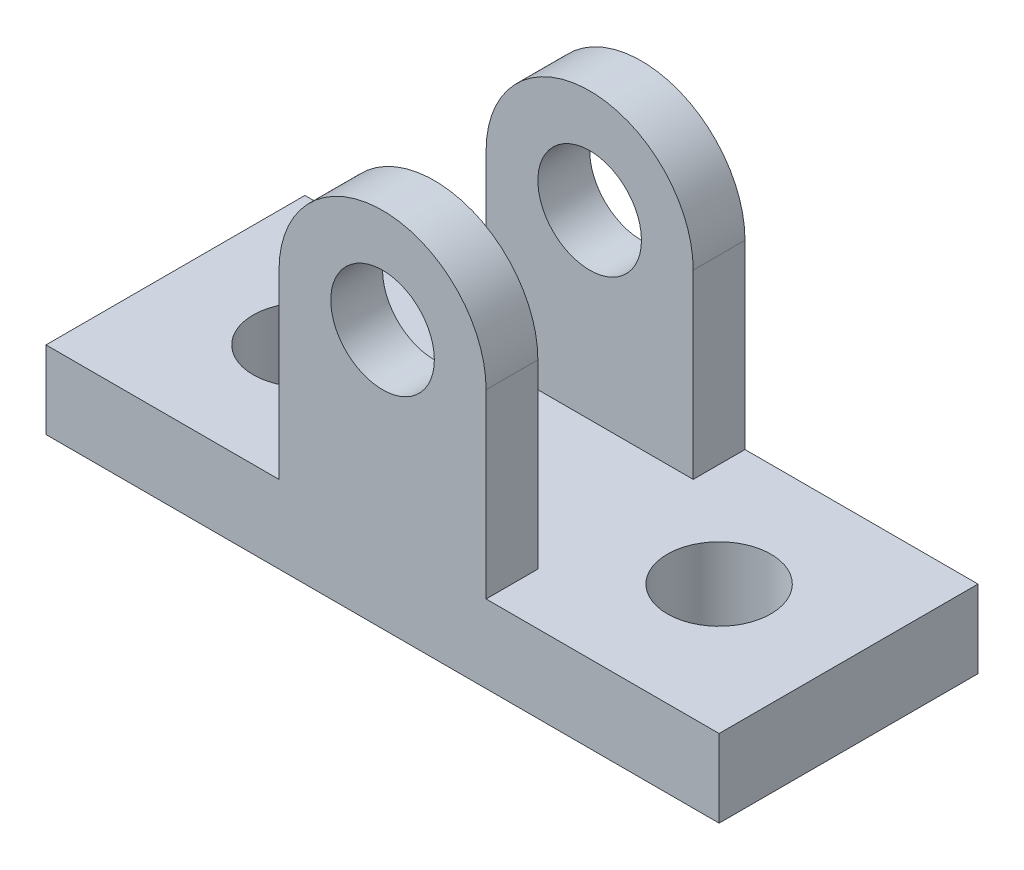
ISO-10303-21;
HEADER;
FILE_DESCRIPTION(('STEP AP214'),'2;1');
FILE_NAME('part.step','',(''),(''),'','','');
FILE_SCHEMA(('AUTOMOTIVE_DESIGN { 1 0 10303 214 1 1 1 1 }'));
ENDSEC;
DATA;
#1=APPLICATION_CONTEXT('core data for automotive mechanical design processes');
#2=APPLICATION_PROTOCOL_DEFINITION('international standard','automotive_design',2000,#1);
#3=PRODUCT_CONTEXT('',#1,'mechanical');
#4=PRODUCT('Part','Part','',(#3));
#5=PRODUCT_RELATED_PRODUCT_CATEGORY('part','',(#4));
#6=PRODUCT_DEFINITION_FORMATION('','',#4);
#7=PRODUCT_DEFINITION_CONTEXT('part definition',#1,'design');
#8=PRODUCT_DEFINITION('design','',#6,#7);
#9=PRODUCT_DEFINITION_SHAPE('','',#8);
#10=(LENGTH_UNIT() NAMED_UNIT(*) SI_UNIT(.MILLI.,.METRE.));
#11=(NAMED_UNIT(*) PLANE_ANGLE_UNIT() SI_UNIT($,.RADIAN.));
#12=(NAMED_UNIT(*) SI_UNIT($,.STERADIAN.) SOLID_ANGLE_UNIT());
#13=UNCERTAINTY_MEASURE_WITH_UNIT(LENGTH_MEASURE(1.E-05),#10,'distance_accuracy_value','');
#14=(GEOMETRIC_REPRESENTATION_CONTEXT(3) GLOBAL_UNCERTAINTY_ASSIGNED_CONTEXT((#13)) GLOBAL_UNIT_ASSIGNED_CONTEXT((#10,
#11,#12)) REPRESENTATION_CONTEXT('',''));
#15=CARTESIAN_POINT('',(0.,0.,0.));
#16=DIRECTION('',(0.,0.,1.));
#17=DIRECTION('',(1.,0.,0.));
#18=AXIS2_PLACEMENT_3D('',#15,#16,#17);
#19=CARTESIAN_POINT('',(20.,50.,50.));
#20=DIRECTION('',(-1.,0.,0.));
#21=DIRECTION('',(0.,-1.,0.));
#22=AXIS2_PLACEMENT_3D('',#19,#20,#21);
#23=PLANE('',#22);
#24=DIRECTION('',(0.,-1.,0.));
#25=VECTOR('',#24,1.);
#26=CARTESIAN_POINT('',(20.,70.,40.));
#27=LINE('',#26,#25);
#28=CARTESIAN_POINT('',(20.,50.,40.));
#29=VERTEX_POINT('',#28);
#30=CARTESIAN_POINT('',(20.,15.,40.));
#31=VERTEX_POINT('',#30);
#32=EDGE_CURVE('E303',#29,#31,#27,.T.);
#33=ORIENTED_EDGE('',*,*,#32,.F.);
#34=DIRECTION('',(0.,0.,-1.));
#35=VECTOR('',#34,1.);
#36=CARTESIAN_POINT('',(20.,50.,50.));
#37=LINE('',#36,#35);
#38=CARTESIAN_POINT('',(20.,50.,50.));
#39=VERTEX_POINT('',#38);
#40=EDGE_CURVE('E201',#39,#29,#37,.T.);
#41=ORIENTED_EDGE('',*,*,#40,.F.);
#42=DIRECTION('',(0.,1.,0.));
#43=VECTOR('',#42,1.);
#44=CARTESIAN_POINT('',(20.,50.,50.));
#45=LINE('',#44,#43);
#46=CARTESIAN_POINT('',(20.,15.,50.));
#47=VERTEX_POINT('',#46);
#48=EDGE_CURVE('E297',#47,#39,#45,.T.);
#49=ORIENTED_EDGE('',*,*,#48,.F.);
#50=DIRECTION('',(0.,0.,-1.));
#51=VECTOR('',#50,1.);
#52=CARTESIAN_POINT('',(20.,15.,50.));
#53=LINE('',#52,#51);
#54=EDGE_CURVE('E206',#47,#31,#53,.T.);
#55=ORIENTED_EDGE('',*,*,#54,.T.);
#56=EDGE_LOOP('',(#33,#41,#49,#55));
#57=FACE_BOUND('',#56,.T.);
#58=ADVANCED_FACE('F47',(#57),#23,.F.);
#59=DIRECTION('',(0.,-1.,0.));
#60=VECTOR('',#59,1.);
#61=CARTESIAN_POINT('',(20.,70.,10.));
#62=LINE('',#61,#60);
#63=CARTESIAN_POINT('',(20.,50.,10.));
#64=VERTEX_POINT('',#63);
#65=CARTESIAN_POINT('',(20.,15.,10.));
#66=VERTEX_POINT('',#65);
#67=EDGE_CURVE('E229',#64,#66,#62,.T.);
#68=ORIENTED_EDGE('',*,*,#67,.T.);
#69=CARTESIAN_POINT('',(20.,15.,0.));
#70=VERTEX_POINT('',#69);
#71=EDGE_CURVE('E205',#66,#70,#53,.T.);
#72=ORIENTED_EDGE('',*,*,#71,.T.);
#73=DIRECTION('',(0.,1.,0.));
#74=VECTOR('',#73,1.);
#75=CARTESIAN_POINT('',(20.,50.,0.));
#76=LINE('',#75,#74);
#77=CARTESIAN_POINT('',(20.,50.,0.));
#78=VERTEX_POINT('',#77);
#79=EDGE_CURVE('E175',#70,#78,#76,.T.);
#80=ORIENTED_EDGE('',*,*,#79,.T.);
#81=EDGE_CURVE('E200',#64,#78,#37,.T.);
#82=ORIENTED_EDGE('',*,*,#81,.F.);
#83=EDGE_LOOP('',(#68,#72,#80,#82));
#84=FACE_BOUND('',#83,.T.);
#85=ADVANCED_FACE('F225',(#84),#23,.F.);
#86=CARTESIAN_POINT('',(0.,50.,50.));
#87=DIRECTION('',(0.,0.,-1.));
#88=DIRECTION('',(-1.,0.,0.));
#89=AXIS2_PLACEMENT_3D('',#86,#87,#88);
#90=CYLINDRICAL_SURFACE('',#89,20.);
#91=CARTESIAN_POINT('',(0.,50.,40.));
#92=DIRECTION('',(0.,0.,-1.));
#93=DIRECTION('',(-1.,0.,0.));
#94=AXIS2_PLACEMENT_3D('',#91,#92,#93);
#95=CIRCLE('',#94,20.);
#96=CARTESIAN_POINT('',(-20.,50.,40.));
#97=VERTEX_POINT('',#96);
#98=EDGE_CURVE('E308',#97,#29,#95,.T.);
#99=ORIENTED_EDGE('',*,*,#98,.F.);
#100=DIRECTION('',(0.,0.,-1.));
#101=VECTOR('',#100,1.);
#102=CARTESIAN_POINT('',(-20.,50.,50.));
#103=LINE('',#102,#101);
#104=CARTESIAN_POINT('',(-20.,50.,50.));
#105=VERTEX_POINT('',#104);
#106=EDGE_CURVE('E197',#105,#97,#103,.T.);
#107=ORIENTED_EDGE('',*,*,#106,.F.);
#108=CARTESIAN_POINT('',(0.,50.,50.));
#109=DIRECTION('',(0.,0.,1.));
#110=DIRECTION('',(1.,0.,0.));
#111=AXIS2_PLACEMENT_3D('',#108,#109,#110);
#112=CIRCLE('',#111,20.);
#113=EDGE_CURVE('E135',#39,#105,#112,.T.);
#114=ORIENTED_EDGE('',*,*,#113,.F.);
#115=ORIENTED_EDGE('',*,*,#40,.T.);
#116=EDGE_LOOP('',(#99,#107,#114,#115));
#117=FACE_BOUND('',#116,.T.);
#118=ADVANCED_FACE('F265',(#117),#90,.T.);
#119=CARTESIAN_POINT('',(0.,50.,10.));
#120=DIRECTION('',(0.,0.,1.));
#121=DIRECTION('',(1.,0.,0.));
#122=AXIS2_PLACEMENT_3D('',#119,#120,#121);
#123=CIRCLE('',#122,20.);
#124=CARTESIAN_POINT('',(-20.,50.,10.));
#125=VERTEX_POINT('',#124);
#126=EDGE_CURVE('E323',#64,#125,#123,.T.);
#127=ORIENTED_EDGE('',*,*,#126,.F.);
#128=ORIENTED_EDGE('',*,*,#81,.T.);
#129=CARTESIAN_POINT('',(0.,50.,0.));
#130=DIRECTION('',(0.,0.,1.));
#131=DIRECTION('',(1.,0.,0.));
#132=AXIS2_PLACEMENT_3D('',#129,#130,#131);
#133=CIRCLE('',#132,20.);
#134=CARTESIAN_POINT('',(-20.,50.,0.));
#135=VERTEX_POINT('',#134);
#136=EDGE_CURVE('E179',#78,#135,#133,.T.);
#137=ORIENTED_EDGE('',*,*,#136,.T.);
#138=EDGE_CURVE('E150',#125,#135,#103,.T.);
#139=ORIENTED_EDGE('',*,*,#138,.F.);
#140=EDGE_LOOP('',(#127,#128,#137,#139));
#141=FACE_BOUND('',#140,.T.);
#142=ADVANCED_FACE('F370',(#141),#90,.T.);
#143=CARTESIAN_POINT('',(-20.,15.,50.));
#144=DIRECTION('',(1.,0.,0.));
#145=DIRECTION('',(0.,0.,-1.));
#146=AXIS2_PLACEMENT_3D('',#143,#144,#145);
#147=PLANE('',#146);
#148=DIRECTION('',(0.,-1.,0.));
#149=VECTOR('',#148,1.);
#150=CARTESIAN_POINT('',(-20.,70.,40.));
#151=LINE('',#150,#149);
#152=CARTESIAN_POINT('',(-20.,15.,40.));
#153=VERTEX_POINT('',#152);
#154=EDGE_CURVE('E147',#97,#153,#151,.T.);
#155=ORIENTED_EDGE('',*,*,#154,.T.);
#156=DIRECTION('',(0.,0.,-1.));
#157=VECTOR('',#156,1.);
#158=CARTESIAN_POINT('',(-20.,15.,50.));
#159=LINE('',#158,#157);
#160=CARTESIAN_POINT('',(-20.,15.,50.));
#161=VERTEX_POINT('',#160);
#162=EDGE_CURVE('E143',#161,#153,#159,.T.);
#163=ORIENTED_EDGE('',*,*,#162,.F.);
#164=DIRECTION('',(0.,-1.,0.));
#165=VECTOR('',#164,1.);
#166=CARTESIAN_POINT('',(-20.,15.,50.));
#167=LINE('',#166,#165);
#168=EDGE_CURVE('E128',#105,#161,#167,.T.);
#169=ORIENTED_EDGE('',*,*,#168,.F.);
#170=ORIENTED_EDGE('',*,*,#106,.T.);
#171=EDGE_LOOP('',(#155,#163,#169,#170));
#172=FACE_BOUND('',#171,.T.);
#173=ADVANCED_FACE('F144',(#172),#147,.F.);
#174=DIRECTION('',(0.,-1.,0.));
#175=VECTOR('',#174,1.);
#176=CARTESIAN_POINT('',(-20.,70.,10.));
#177=LINE('',#176,#175);
#178=CARTESIAN_POINT('',(-20.,15.,10.));
#179=VERTEX_POINT('',#178);
#180=EDGE_CURVE('E338',#125,#179,#177,.T.);
#181=ORIENTED_EDGE('',*,*,#180,.F.);
#182=ORIENTED_EDGE('',*,*,#138,.T.);
#183=DIRECTION('',(0.,-1.,0.));
#184=VECTOR('',#183,1.);
#185=CARTESIAN_POINT('',(-20.,15.,0.));
#186=LINE('',#185,#184);
#187=CARTESIAN_POINT('',(-20.,15.,0.));
#188=VERTEX_POINT('',#187);
#189=EDGE_CURVE('E183',#135,#188,#186,.T.);
#190=ORIENTED_EDGE('',*,*,#189,.T.);
#191=EDGE_CURVE('E151',#179,#188,#159,.T.);
#192=ORIENTED_EDGE('',*,*,#191,.F.);
#193=EDGE_LOOP('',(#181,#182,#190,#192));
#194=FACE_BOUND('',#193,.T.);
#195=ADVANCED_FACE('F238',(#194),#147,.F.);
#196=CARTESIAN_POINT('',(65.,0.,50.));
#197=DIRECTION('',(0.,1.,0.));
#198=DIRECTION('',(-1.,0.,0.));
#199=AXIS2_PLACEMENT_3D('',#196,#197,#198);
#200=PLANE('',#199);
#201=CARTESIAN_POINT('',(40.,0.,25.));
#202=DIRECTION('',(0.,1.,0.));
#203=DIRECTION('',(-1.,0.,0.));
#204=AXIS2_PLACEMENT_3D('',#201,#202,#203);
#205=CIRCLE('',#204,10.);
#206=CARTESIAN_POINT('',(30.,0.,25.));
#207=VERTEX_POINT('',#206);
#208=EDGE_CURVE('E279',#207,#207,#205,.T.);
#209=ORIENTED_EDGE('',*,*,#208,.T.);
#210=EDGE_LOOP('',(#209));
#211=FACE_BOUND('',#210,.T.);
#212=CARTESIAN_POINT('',(-40.,0.,25.));
#213=DIRECTION('',(0.,1.,0.));
#214=DIRECTION('',(-1.,0.,0.));
#215=AXIS2_PLACEMENT_3D('',#212,#213,#214);
#216=CIRCLE('',#215,10.);
#217=CARTESIAN_POINT('',(-50.,0.,25.));
#218=VERTEX_POINT('',#217);
#219=EDGE_CURVE('E168',#218,#218,#216,.T.);
#220=ORIENTED_EDGE('',*,*,#219,.T.);
#221=EDGE_LOOP('',(#220));
#222=FACE_BOUND('',#221,.T.);
#223=DIRECTION('',(1.,0.,0.));
#224=VECTOR('',#223,1.);
#225=CARTESIAN_POINT('',(65.,0.,0.));
#226=LINE('',#225,#224);
#227=CARTESIAN_POINT('',(-65.,0.,0.));
#228=VERTEX_POINT('',#227);
#229=CARTESIAN_POINT('',(65.,0.,0.));
#230=VERTEX_POINT('',#229);
#231=EDGE_CURVE('E163',#228,#230,#226,.T.);
#232=ORIENTED_EDGE('',*,*,#231,.T.);
#233=DIRECTION('',(0.,0.,-1.));
#234=VECTOR('',#233,1.);
#235=CARTESIAN_POINT('',(65.,0.,50.));
#236=LINE('',#235,#234);
#237=CARTESIAN_POINT('',(65.,0.,50.));
#238=VERTEX_POINT('',#237);
#239=EDGE_CURVE('E11',#238,#230,#236,.T.);
#240=ORIENTED_EDGE('',*,*,#239,.F.);
#241=DIRECTION('',(1.,0.,0.));
#242=VECTOR('',#241,1.);
#243=CARTESIAN_POINT('',(65.,0.,50.));
#244=LINE('',#243,#242);
#245=CARTESIAN_POINT('',(-65.,0.,50.));
#246=VERTEX_POINT('',#245);
#247=EDGE_CURVE('E192',#246,#238,#244,.T.);
#248=ORIENTED_EDGE('',*,*,#247,.F.);
#249=DIRECTION('',(0.,0.,-1.));
#250=VECTOR('',#249,1.);
#251=CARTESIAN_POINT('',(-65.,0.,50.));
#252=LINE('',#251,#250);
#253=EDGE_CURVE('E159',#246,#228,#252,.T.);
#254=ORIENTED_EDGE('',*,*,#253,.T.);
#255=EDGE_LOOP('',(#232,#240,#248,#254));
#256=FACE_BOUND('',#255,.T.);
#257=ADVANCED_FACE('F49',(#211,#222,#256),#200,.F.);
#258=CARTESIAN_POINT('',(65.,15.,50.));
#259=DIRECTION('',(-1.,0.,0.));
#260=DIRECTION('',(0.,0.,1.));
#261=AXIS2_PLACEMENT_3D('',#258,#259,#260);
#262=PLANE('',#261);
#263=DIRECTION('',(0.,1.,0.));
#264=VECTOR('',#263,1.);
#265=CARTESIAN_POINT('',(65.,15.,0.));
#266=LINE('',#265,#264);
#267=CARTESIAN_POINT('',(65.,15.,0.));
#268=VERTEX_POINT('',#267);
#269=EDGE_CURVE('E167',#230,#268,#266,.T.);
#270=ORIENTED_EDGE('',*,*,#269,.T.);
#271=DIRECTION('',(0.,0.,-1.));
#272=VECTOR('',#271,1.);
#273=CARTESIAN_POINT('',(65.,15.,50.));
#274=LINE('',#273,#272);
#275=CARTESIAN_POINT('',(65.,15.,50.));
#276=VERTEX_POINT('',#275);
#277=EDGE_CURVE('E57',#276,#268,#274,.T.);
#278=ORIENTED_EDGE('',*,*,#277,.F.);
#279=DIRECTION('',(0.,1.,0.));
#280=VECTOR('',#279,1.);
#281=CARTESIAN_POINT('',(65.,15.,50.));
#282=LINE('',#281,#280);
#283=EDGE_CURVE('E113',#238,#276,#282,.T.);
#284=ORIENTED_EDGE('',*,*,#283,.F.);
#285=ORIENTED_EDGE('',*,*,#239,.T.);
#286=EDGE_LOOP('',(#270,#278,#284,#285));
#287=FACE_BOUND('',#286,.T.);
#288=ADVANCED_FACE('F254',(#287),#262,.F.);
#289=CARTESIAN_POINT('',(-65.,15.,50.));
#290=DIRECTION('',(0.,-1.,0.));
#291=DIRECTION('',(1.,0.,0.));
#292=AXIS2_PLACEMENT_3D('',#289,#290,#291);
#293=PLANE('',#292);
#294=CARTESIAN_POINT('',(-40.,15.,25.));
#295=DIRECTION('',(0.,1.,0.));
#296=DIRECTION('',(0.,0.,1.));
#297=AXIS2_PLACEMENT_3D('',#294,#295,#296);
#298=CIRCLE('',#297,10.);
#299=CARTESIAN_POINT('',(-40.,15.,35.));
#300=VERTEX_POINT('',#299);
#301=EDGE_CURVE('E284',#300,#300,#298,.T.);
#302=ORIENTED_EDGE('',*,*,#301,.F.);
#303=EDGE_LOOP('',(#302));
#304=FACE_BOUND('',#303,.T.);
#305=DIRECTION('',(-1.,0.,0.));
#306=VECTOR('',#305,1.);
#307=CARTESIAN_POINT('',(-65.,15.,0.));
#308=LINE('',#307,#306);
#309=CARTESIAN_POINT('',(-65.,15.,0.));
#310=VERTEX_POINT('',#309);
#311=EDGE_CURVE('E187',#188,#310,#308,.T.);
#312=ORIENTED_EDGE('',*,*,#311,.T.);
#313=DIRECTION('',(0.,0.,-1.));
#314=VECTOR('',#313,1.);
#315=CARTESIAN_POINT('',(-65.,15.,50.));
#316=LINE('',#315,#314);
#317=CARTESIAN_POINT('',(-65.,15.,50.));
#318=VERTEX_POINT('',#317);
#319=EDGE_CURVE('E155',#318,#310,#316,.T.);
#320=ORIENTED_EDGE('',*,*,#319,.F.);
#321=DIRECTION('',(-1.,0.,0.));
#322=VECTOR('',#321,1.);
#323=CARTESIAN_POINT('',(-65.,15.,50.));
#324=LINE('',#323,#322);
#325=EDGE_CURVE('E132',#161,#318,#324,.T.);
#326=ORIENTED_EDGE('',*,*,#325,.F.);
#327=ORIENTED_EDGE('',*,*,#162,.T.);
#328=DIRECTION('',(1.,0.,0.));
#329=VECTOR('',#328,1.);
#330=CARTESIAN_POINT('',(-20.,15.,40.));
#331=LINE('',#330,#329);
#332=EDGE_CURVE('E343',#153,#31,#331,.T.);
#333=ORIENTED_EDGE('',*,*,#332,.T.);
#334=ORIENTED_EDGE('',*,*,#54,.F.);
#335=DIRECTION('',(-1.,0.,0.));
#336=VECTOR('',#335,1.);
#337=CARTESIAN_POINT('',(20.,15.,50.));
#338=LINE('',#337,#336);
#339=EDGE_CURVE('E216',#276,#47,#338,.T.);
#340=ORIENTED_EDGE('',*,*,#339,.F.);
#341=ORIENTED_EDGE('',*,*,#277,.T.);
#342=DIRECTION('',(-1.,0.,0.));
#343=VECTOR('',#342,1.);
#344=CARTESIAN_POINT('',(20.,15.,0.));
#345=LINE('',#344,#343);
#346=EDGE_CURVE('E171',#268,#70,#345,.T.);
#347=ORIENTED_EDGE('',*,*,#346,.T.);
#348=ORIENTED_EDGE('',*,*,#71,.F.);
#349=DIRECTION('',(-1.,0.,0.));
#350=VECTOR('',#349,1.);
#351=CARTESIAN_POINT('',(-20.,15.,10.));
#352=LINE('',#351,#350);
#353=EDGE_CURVE('E64',#66,#179,#352,.T.);
#354=ORIENTED_EDGE('',*,*,#353,.T.);
#355=ORIENTED_EDGE('',*,*,#191,.T.);
#356=EDGE_LOOP('',(#312,#320,#326,#327,#333,#334,#340,#341,#347,#348,#354,#355));
#357=FACE_BOUND('',#356,.T.);
#358=CARTESIAN_POINT('',(40.,15.,25.));
#359=DIRECTION('',(0.,1.,0.));
#360=DIRECTION('',(0.,0.,1.));
#361=AXIS2_PLACEMENT_3D('',#358,#359,#360);
#362=CIRCLE('',#361,10.);
#363=CARTESIAN_POINT('',(40.,15.,35.));
#364=VERTEX_POINT('',#363);
#365=EDGE_CURVE('E322',#364,#364,#362,.T.);
#366=ORIENTED_EDGE('',*,*,#365,.F.);
#367=EDGE_LOOP('',(#366));
#368=FACE_BOUND('',#367,.T.);
#369=ADVANCED_FACE('F153',(#304,#357,#368),#293,.F.);
#370=CARTESIAN_POINT('',(-65.,0.,50.));
#371=DIRECTION('',(1.,0.,0.));
#372=DIRECTION('',(0.,0.,-1.));
#373=AXIS2_PLACEMENT_3D('',#370,#371,#372);
#374=PLANE('',#373);
#375=DIRECTION('',(0.,-1.,0.));
#376=VECTOR('',#375,1.);
#377=CARTESIAN_POINT('',(-65.,0.,0.));
#378=LINE('',#377,#376);
#379=EDGE_CURVE('E105',#310,#228,#378,.T.);
#380=ORIENTED_EDGE('',*,*,#379,.T.);
#381=ORIENTED_EDGE('',*,*,#253,.F.);
#382=DIRECTION('',(0.,-1.,0.));
#383=VECTOR('',#382,1.);
#384=CARTESIAN_POINT('',(-65.,0.,50.));
#385=LINE('',#384,#383);
#386=EDGE_CURVE('E73',#318,#246,#385,.T.);
#387=ORIENTED_EDGE('',*,*,#386,.F.);
#388=ORIENTED_EDGE('',*,*,#319,.T.);
#389=EDGE_LOOP('',(#380,#381,#387,#388));
#390=FACE_BOUND('',#389,.T.);
#391=ADVANCED_FACE('F243',(#390),#374,.F.);
#392=CARTESIAN_POINT('',(0.,50.,50.));
#393=DIRECTION('',(0.,0.,1.));
#394=DIRECTION('',(1.,0.,0.));
#395=AXIS2_PLACEMENT_3D('',#392,#393,#394);
#396=PLANE('',#395);
#397=CARTESIAN_POINT('',(0.,50.,50.));
#398=DIRECTION('',(0.,0.,1.));
#399=DIRECTION('',(1.,0.,0.));
#400=AXIS2_PLACEMENT_3D('',#397,#398,#399);
#401=CIRCLE('',#400,10.);
#402=CARTESIAN_POINT('',(10.,50.,50.));
#403=VERTEX_POINT('',#402);
#404=EDGE_CURVE('E350',#403,#403,#401,.T.);
#405=ORIENTED_EDGE('',*,*,#404,.F.);
#406=EDGE_LOOP('',(#405));
#407=FACE_BOUND('',#406,.T.);
#408=ORIENTED_EDGE('',*,*,#247,.T.);
#409=ORIENTED_EDGE('',*,*,#283,.T.);
#410=ORIENTED_EDGE('',*,*,#339,.T.);
#411=ORIENTED_EDGE('',*,*,#48,.T.);
#412=ORIENTED_EDGE('',*,*,#113,.T.);
#413=ORIENTED_EDGE('',*,*,#168,.T.);
#414=ORIENTED_EDGE('',*,*,#325,.T.);
#415=ORIENTED_EDGE('',*,*,#386,.T.);
#416=EDGE_LOOP('',(#408,#409,#410,#411,#412,#413,#414,#415));
#417=FACE_BOUND('',#416,.T.);
#418=ADVANCED_FACE('F130',(#407,#417),#396,.T.);
#419=CARTESIAN_POINT('',(0.,50.,0.));
#420=DIRECTION('',(0.,0.,1.));
#421=DIRECTION('',(1.,0.,0.));
#422=AXIS2_PLACEMENT_3D('',#419,#420,#421);
#423=PLANE('',#422);
#424=CARTESIAN_POINT('',(0.,50.,0.));
#425=DIRECTION('',(0.,0.,1.));
#426=DIRECTION('',(1.,0.,0.));
#427=AXIS2_PLACEMENT_3D('',#424,#425,#426);
#428=CIRCLE('',#427,10.);
#429=CARTESIAN_POINT('',(10.,50.,0.));
#430=VERTEX_POINT('',#429);
#431=EDGE_CURVE('E354',#430,#430,#428,.T.);
#432=ORIENTED_EDGE('',*,*,#431,.T.);
#433=EDGE_LOOP('',(#432));
#434=FACE_BOUND('',#433,.T.);
#435=ORIENTED_EDGE('',*,*,#231,.F.);
#436=ORIENTED_EDGE('',*,*,#379,.F.);
#437=ORIENTED_EDGE('',*,*,#311,.F.);
#438=ORIENTED_EDGE('',*,*,#189,.F.);
#439=ORIENTED_EDGE('',*,*,#136,.F.);
#440=ORIENTED_EDGE('',*,*,#79,.F.);
#441=ORIENTED_EDGE('',*,*,#346,.F.);
#442=ORIENTED_EDGE('',*,*,#269,.F.);
#443=EDGE_LOOP('',(#435,#436,#437,#438,#439,#440,#441,#442));
#444=FACE_BOUND('',#443,.T.);
#445=ADVANCED_FACE('F219',(#434,#444),#423,.F.);
#446=CARTESIAN_POINT('',(-40.,-10.,25.));
#447=DIRECTION('',(0.,1.,0.));
#448=DIRECTION('',(0.,0.,1.));
#449=AXIS2_PLACEMENT_3D('',#446,#447,#448);
#450=CYLINDRICAL_SURFACE('',#449,10.);
#451=ORIENTED_EDGE('',*,*,#301,.T.);
#452=EDGE_LOOP('',(#451));
#453=FACE_BOUND('',#452,.T.);
#454=ORIENTED_EDGE('',*,*,#219,.F.);
#455=EDGE_LOOP('',(#454));
#456=FACE_BOUND('',#455,.T.);
#457=ADVANCED_FACE('F431',(#453,#456),#450,.F.);
#458=CARTESIAN_POINT('',(40.,-10.,25.));
#459=DIRECTION('',(0.,1.,0.));
#460=DIRECTION('',(0.,0.,1.));
#461=AXIS2_PLACEMENT_3D('',#458,#459,#460);
#462=CYLINDRICAL_SURFACE('',#461,10.);
#463=ORIENTED_EDGE('',*,*,#365,.T.);
#464=EDGE_LOOP('',(#463));
#465=FACE_BOUND('',#464,.T.);
#466=ORIENTED_EDGE('',*,*,#208,.F.);
#467=EDGE_LOOP('',(#466));
#468=FACE_BOUND('',#467,.T.);
#469=ADVANCED_FACE('F399',(#465,#468),#462,.F.);
#470=CARTESIAN_POINT('',(-20.,70.,40.));
#471=DIRECTION('',(0.,0.,-1.));
#472=DIRECTION('',(-1.,0.,0.));
#473=AXIS2_PLACEMENT_3D('',#470,#471,#472);
#474=PLANE('',#473);
#475=CARTESIAN_POINT('',(0.,50.,40.));
#476=DIRECTION('',(0.,0.,-1.));
#477=DIRECTION('',(-1.,0.,0.));
#478=AXIS2_PLACEMENT_3D('',#475,#476,#477);
#479=CIRCLE('',#478,10.);
#480=CARTESIAN_POINT('',(-10.,50.,40.));
#481=VERTEX_POINT('',#480);
#482=EDGE_CURVE('E346',#481,#481,#479,.T.);
#483=ORIENTED_EDGE('',*,*,#482,.F.);
#484=EDGE_LOOP('',(#483));
#485=FACE_BOUND('',#484,.T.);
#486=ORIENTED_EDGE('',*,*,#98,.T.);
#487=ORIENTED_EDGE('',*,*,#32,.T.);
#488=ORIENTED_EDGE('',*,*,#332,.F.);
#489=ORIENTED_EDGE('',*,*,#154,.F.);
#490=EDGE_LOOP('',(#486,#487,#488,#489));
#491=FACE_BOUND('',#490,.T.);
#492=ADVANCED_FACE('F320',(#485,#491),#474,.T.);
#493=CARTESIAN_POINT('',(-20.,70.,10.));
#494=DIRECTION('',(0.,0.,1.));
#495=DIRECTION('',(1.,0.,0.));
#496=AXIS2_PLACEMENT_3D('',#493,#494,#495);
#497=PLANE('',#496);
#498=CARTESIAN_POINT('',(0.,50.,10.));
#499=DIRECTION('',(0.,0.,1.));
#500=DIRECTION('',(1.,0.,0.));
#501=AXIS2_PLACEMENT_3D('',#498,#499,#500);
#502=CIRCLE('',#501,10.);
#503=CARTESIAN_POINT('',(10.,50.,10.));
#504=VERTEX_POINT('',#503);
#505=EDGE_CURVE('E51',#504,#504,#502,.T.);
#506=ORIENTED_EDGE('',*,*,#505,.F.);
#507=EDGE_LOOP('',(#506));
#508=FACE_BOUND('',#507,.T.);
#509=ORIENTED_EDGE('',*,*,#126,.T.);
#510=ORIENTED_EDGE('',*,*,#180,.T.);
#511=ORIENTED_EDGE('',*,*,#353,.F.);
#512=ORIENTED_EDGE('',*,*,#67,.F.);
#513=EDGE_LOOP('',(#509,#510,#511,#512));
#514=FACE_BOUND('',#513,.T.);
#515=ADVANCED_FACE('F366',(#508,#514),#497,.T.);
#516=CARTESIAN_POINT('',(0.,50.,0.));
#517=DIRECTION('',(0.,0.,1.));
#518=DIRECTION('',(1.,0.,0.));
#519=AXIS2_PLACEMENT_3D('',#516,#517,#518);
#520=CYLINDRICAL_SURFACE('',#519,10.);
#521=ORIENTED_EDGE('',*,*,#505,.T.);
#522=EDGE_LOOP('',(#521));
#523=FACE_BOUND('',#522,.T.);
#524=ORIENTED_EDGE('',*,*,#431,.F.);
#525=EDGE_LOOP('',(#524));
#526=FACE_BOUND('',#525,.T.);
#527=ADVANCED_FACE('F363',(#523,#526),#520,.F.);
#528=ORIENTED_EDGE('',*,*,#482,.T.);
#529=EDGE_LOOP('',(#528));
#530=FACE_BOUND('',#529,.T.);
#531=ORIENTED_EDGE('',*,*,#404,.T.);
#532=EDGE_LOOP('',(#531));
#533=FACE_BOUND('',#532,.T.);
#534=ADVANCED_FACE('F414',(#530,#533),#520,.F.);
#535=CLOSED_SHELL('',(#58,#85,#118,#142,#173,#195,#257,#288,#369,#391,#418,#445,#457,#469,#492,
#515,#527,#534));
#536=MANIFOLD_SOLID_BREP('B2',#535);
#537=ADVANCED_BREP_SHAPE_REPRESENTATION('',(#18,#536),#14);
#538=SHAPE_DEFINITION_REPRESENTATION(#9,#537);
ENDSEC;
END-ISO-10303-21;
